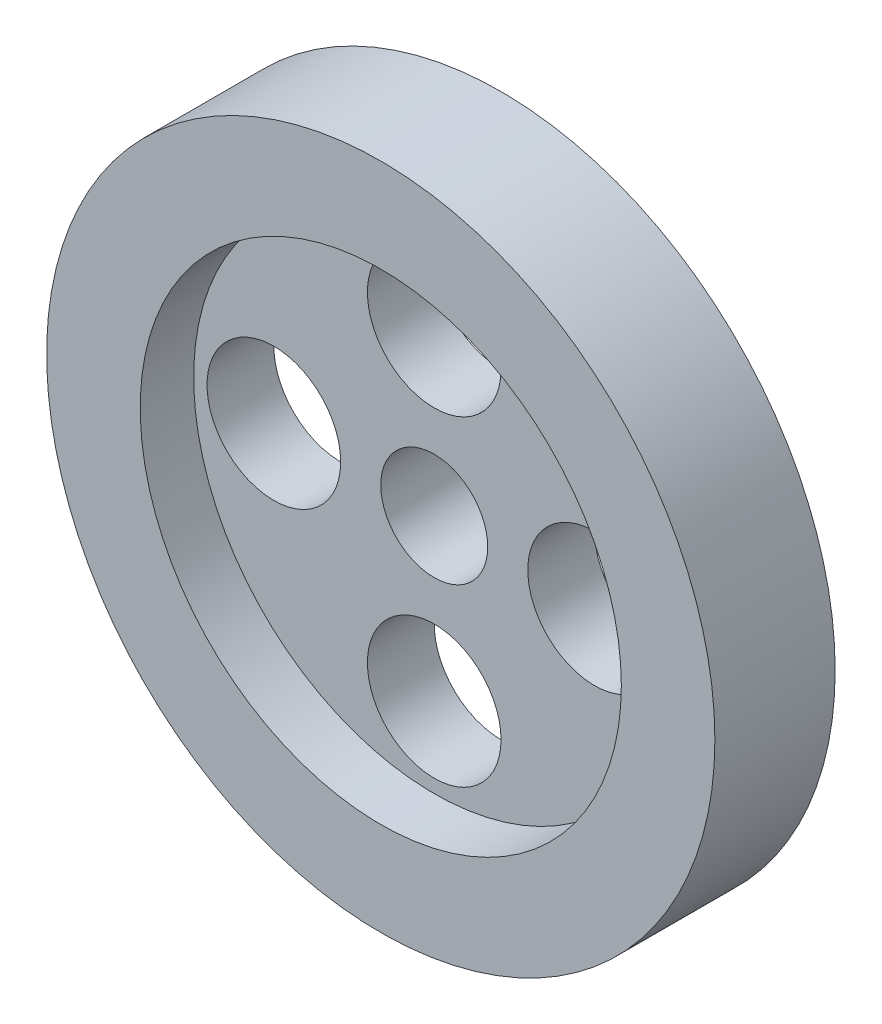
ISO-10303-21;
HEADER;
FILE_DESCRIPTION(('STEP AP214'),'2;1');
FILE_NAME('part.step','',(''),(''),'','','');
FILE_SCHEMA(('AUTOMOTIVE_DESIGN { 1 0 10303 214 1 1 1 1 }'));
ENDSEC;
DATA;
#1=APPLICATION_CONTEXT('core data for automotive mechanical design processes');
#2=APPLICATION_PROTOCOL_DEFINITION('international standard','automotive_design',2000,#1);
#3=PRODUCT_CONTEXT('',#1,'mechanical');
#4=PRODUCT('Part','Part','',(#3));
#5=PRODUCT_RELATED_PRODUCT_CATEGORY('part','',(#4));
#6=PRODUCT_DEFINITION_FORMATION('','',#4);
#7=PRODUCT_DEFINITION_CONTEXT('part definition',#1,'design');
#8=PRODUCT_DEFINITION('design','',#6,#7);
#9=PRODUCT_DEFINITION_SHAPE('','',#8);
#10=(LENGTH_UNIT() NAMED_UNIT(*) SI_UNIT(.MILLI.,.METRE.));
#11=(NAMED_UNIT(*) PLANE_ANGLE_UNIT() SI_UNIT($,.RADIAN.));
#12=(NAMED_UNIT(*) SI_UNIT($,.STERADIAN.) SOLID_ANGLE_UNIT());
#13=UNCERTAINTY_MEASURE_WITH_UNIT(LENGTH_MEASURE(1.E-05),#10,'distance_accuracy_value','');
#14=(GEOMETRIC_REPRESENTATION_CONTEXT(3) GLOBAL_UNCERTAINTY_ASSIGNED_CONTEXT((#13)) GLOBAL_UNIT_ASSIGNED_CONTEXT((#10,
#11,#12)) REPRESENTATION_CONTEXT('',''));
#15=CARTESIAN_POINT('',(0.,0.,0.));
#16=DIRECTION('',(0.,0.,1.));
#17=DIRECTION('',(1.,0.,0.));
#18=AXIS2_PLACEMENT_3D('',#15,#16,#17);
#19=CARTESIAN_POINT('',(0.,0.,0.));
#20=DIRECTION('',(0.,0.,1.));
#21=DIRECTION('',(1.,0.,0.));
#22=AXIS2_PLACEMENT_3D('',#19,#20,#21);
#23=PLANE('',#22);
#24=CARTESIAN_POINT('',(-12.,0.,0.));
#25=DIRECTION('',(0.,0.,1.));
#26=DIRECTION('',(1.,0.,0.));
#27=AXIS2_PLACEMENT_3D('',#24,#25,#26);
#28=CIRCLE('',#27,5.00000000000012);
#29=CARTESIAN_POINT('',(-6.99999999999988,0.,0.));
#30=VERTEX_POINT('',#29);
#31=EDGE_CURVE('E97',#30,#30,#28,.T.);
#32=ORIENTED_EDGE('',*,*,#31,.T.);
#33=EDGE_LOOP('',(#32));
#34=FACE_BOUND('',#33,.T.);
#35=CARTESIAN_POINT('',(0.,-12.,0.));
#36=DIRECTION('',(0.,0.,1.));
#37=DIRECTION('',(1.,0.,0.));
#38=AXIS2_PLACEMENT_3D('',#35,#36,#37);
#39=CIRCLE('',#38,5.00000000000008);
#40=CARTESIAN_POINT('',(5.00000000000008,-12.,0.));
#41=VERTEX_POINT('',#40);
#42=EDGE_CURVE('E101',#41,#41,#39,.T.);
#43=ORIENTED_EDGE('',*,*,#42,.T.);
#44=EDGE_LOOP('',(#43));
#45=FACE_BOUND('',#44,.T.);
#46=CARTESIAN_POINT('',(12.,0.,0.));
#47=DIRECTION('',(0.,0.,1.));
#48=DIRECTION('',(1.,0.,0.));
#49=AXIS2_PLACEMENT_3D('',#46,#47,#48);
#50=CIRCLE('',#49,5.);
#51=CARTESIAN_POINT('',(17.,0.,0.));
#52=VERTEX_POINT('',#51);
#53=EDGE_CURVE('E104',#52,#52,#50,.T.);
#54=ORIENTED_EDGE('',*,*,#53,.T.);
#55=EDGE_LOOP('',(#54));
#56=FACE_BOUND('',#55,.T.);
#57=CARTESIAN_POINT('',(0.,12.,0.));
#58=DIRECTION('',(0.,0.,1.));
#59=DIRECTION('',(1.,0.,0.));
#60=AXIS2_PLACEMENT_3D('',#57,#58,#59);
#61=CIRCLE('',#60,5.);
#62=CARTESIAN_POINT('',(5.,12.,0.));
#63=VERTEX_POINT('',#62);
#64=EDGE_CURVE('E58',#63,#63,#61,.T.);
#65=ORIENTED_EDGE('',*,*,#64,.T.);
#66=EDGE_LOOP('',(#65));
#67=FACE_BOUND('',#66,.T.);
#68=CARTESIAN_POINT('',(0.,0.,0.));
#69=DIRECTION('',(0.,0.,1.));
#70=DIRECTION('',(1.,0.,0.));
#71=AXIS2_PLACEMENT_3D('',#68,#69,#70);
#72=CIRCLE('',#71,25.);
#73=CARTESIAN_POINT('',(25.,0.,0.));
#74=VERTEX_POINT('',#73);
#75=EDGE_CURVE('E52',#74,#74,#72,.T.);
#76=ORIENTED_EDGE('',*,*,#75,.F.);
#77=EDGE_LOOP('',(#76));
#78=FACE_BOUND('',#77,.T.);
#79=CARTESIAN_POINT('',(0.,0.,0.));
#80=DIRECTION('',(0.,0.,1.));
#81=DIRECTION('',(1.,0.,0.));
#82=AXIS2_PLACEMENT_3D('',#79,#80,#81);
#83=CIRCLE('',#82,6.);
#84=CARTESIAN_POINT('',(6.,0.,0.));
#85=VERTEX_POINT('',#84);
#86=EDGE_CURVE('E10',#85,#85,#83,.F.);
#87=ORIENTED_EDGE('',*,*,#86,.F.);
#88=EDGE_LOOP('',(#87));
#89=FACE_BOUND('',#88,.T.);
#90=ADVANCED_FACE('F39',(#34,#45,#56,#67,#78,#89),#23,.F.);
#91=CARTESIAN_POINT('',(0.,12.,9.));
#92=DIRECTION('',(0.,0.,-1.));
#93=DIRECTION('',(-1.,0.,0.));
#94=AXIS2_PLACEMENT_3D('',#91,#92,#93);
#95=CYLINDRICAL_SURFACE('',#94,5.);
#96=ORIENTED_EDGE('',*,*,#64,.F.);
#97=EDGE_LOOP('',(#96));
#98=FACE_BOUND('',#97,.T.);
#99=CARTESIAN_POINT('',(0.,12.,5.));
#100=DIRECTION('',(0.,0.,1.));
#101=DIRECTION('',(1.,0.,0.));
#102=AXIS2_PLACEMENT_3D('',#99,#100,#101);
#103=CIRCLE('',#102,5.);
#104=CARTESIAN_POINT('',(5.,12.,5.));
#105=VERTEX_POINT('',#104);
#106=EDGE_CURVE('E93',#105,#105,#103,.T.);
#107=ORIENTED_EDGE('',*,*,#106,.T.);
#108=EDGE_LOOP('',(#107));
#109=FACE_BOUND('',#108,.T.);
#110=ADVANCED_FACE('F115',(#98,#109),#95,.F.);
#111=CARTESIAN_POINT('',(0.,0.,9.));
#112=DIRECTION('',(0.,0.,-1.));
#113=DIRECTION('',(-1.,0.,0.));
#114=AXIS2_PLACEMENT_3D('',#111,#112,#113);
#115=CYLINDRICAL_SURFACE('',#114,4.);
#116=CARTESIAN_POINT('',(0.,0.,5.));
#117=DIRECTION('',(0.,0.,1.));
#118=DIRECTION('',(1.,0.,0.));
#119=AXIS2_PLACEMENT_3D('',#116,#117,#118);
#120=CIRCLE('',#119,4.);
#121=CARTESIAN_POINT('',(4.,0.,5.));
#122=VERTEX_POINT('',#121);
#123=EDGE_CURVE('E89',#122,#122,#120,.T.);
#124=ORIENTED_EDGE('',*,*,#123,.T.);
#125=EDGE_LOOP('',(#124));
#126=FACE_BOUND('',#125,.T.);
#127=CARTESIAN_POINT('',(0.,0.,-1.));
#128=DIRECTION('',(0.,0.,-1.));
#129=DIRECTION('',(-1.,0.,0.));
#130=AXIS2_PLACEMENT_3D('',#127,#128,#129);
#131=CIRCLE('',#130,4.);
#132=CARTESIAN_POINT('',(-4.,0.,-1.));
#133=VERTEX_POINT('',#132);
#134=EDGE_CURVE('E167',#133,#133,#131,.T.);
#135=ORIENTED_EDGE('',*,*,#134,.T.);
#136=EDGE_LOOP('',(#135));
#137=FACE_BOUND('',#136,.T.);
#138=ADVANCED_FACE('F118',(#126,#137),#115,.F.);
#139=CARTESIAN_POINT('',(12.,0.,9.));
#140=DIRECTION('',(0.,0.,-1.));
#141=DIRECTION('',(-1.,0.,0.));
#142=AXIS2_PLACEMENT_3D('',#139,#140,#141);
#143=CYLINDRICAL_SURFACE('',#142,5.);
#144=ORIENTED_EDGE('',*,*,#53,.F.);
#145=EDGE_LOOP('',(#144));
#146=FACE_BOUND('',#145,.T.);
#147=CARTESIAN_POINT('',(12.,0.,5.));
#148=DIRECTION('',(0.,0.,1.));
#149=DIRECTION('',(1.,0.,0.));
#150=AXIS2_PLACEMENT_3D('',#147,#148,#149);
#151=CIRCLE('',#150,5.);
#152=CARTESIAN_POINT('',(17.,0.,5.));
#153=VERTEX_POINT('',#152);
#154=EDGE_CURVE('E72',#153,#153,#151,.T.);
#155=ORIENTED_EDGE('',*,*,#154,.T.);
#156=EDGE_LOOP('',(#155));
#157=FACE_BOUND('',#156,.T.);
#158=ADVANCED_FACE('F138',(#146,#157),#143,.F.);
#159=CARTESIAN_POINT('',(0.,-12.,9.));
#160=DIRECTION('',(0.,0.,-1.));
#161=DIRECTION('',(-1.,0.,0.));
#162=AXIS2_PLACEMENT_3D('',#159,#160,#161);
#163=CYLINDRICAL_SURFACE('',#162,5.00000000000008);
#164=ORIENTED_EDGE('',*,*,#42,.F.);
#165=EDGE_LOOP('',(#164));
#166=FACE_BOUND('',#165,.T.);
#167=CARTESIAN_POINT('',(0.,-12.,5.));
#168=DIRECTION('',(0.,0.,1.));
#169=DIRECTION('',(1.,0.,0.));
#170=AXIS2_PLACEMENT_3D('',#167,#168,#169);
#171=CIRCLE('',#170,5.00000000000008);
#172=CARTESIAN_POINT('',(5.00000000000008,-12.,5.));
#173=VERTEX_POINT('',#172);
#174=EDGE_CURVE('E65',#173,#173,#171,.T.);
#175=ORIENTED_EDGE('',*,*,#174,.T.);
#176=EDGE_LOOP('',(#175));
#177=FACE_BOUND('',#176,.T.);
#178=ADVANCED_FACE('F135',(#166,#177),#163,.F.);
#179=CARTESIAN_POINT('',(-12.,0.,9.));
#180=DIRECTION('',(0.,0.,-1.));
#181=DIRECTION('',(-1.,0.,0.));
#182=AXIS2_PLACEMENT_3D('',#179,#180,#181);
#183=CYLINDRICAL_SURFACE('',#182,5.00000000000012);
#184=ORIENTED_EDGE('',*,*,#31,.F.);
#185=EDGE_LOOP('',(#184));
#186=FACE_BOUND('',#185,.T.);
#187=CARTESIAN_POINT('',(-12.,0.,5.));
#188=DIRECTION('',(0.,0.,1.));
#189=DIRECTION('',(1.,0.,0.));
#190=AXIS2_PLACEMENT_3D('',#187,#188,#189);
#191=CIRCLE('',#190,5.00000000000012);
#192=CARTESIAN_POINT('',(-6.99999999999988,0.,5.));
#193=VERTEX_POINT('',#192);
#194=EDGE_CURVE('E62',#193,#193,#191,.T.);
#195=ORIENTED_EDGE('',*,*,#194,.T.);
#196=EDGE_LOOP('',(#195));
#197=FACE_BOUND('',#196,.T.);
#198=ADVANCED_FACE('F137',(#186,#197),#183,.F.);
#199=CARTESIAN_POINT('',(0.,0.,9.));
#200=DIRECTION('',(0.,0.,1.));
#201=DIRECTION('',(1.,0.,0.));
#202=AXIS2_PLACEMENT_3D('',#199,#200,#201);
#203=PLANE('',#202);
#204=CARTESIAN_POINT('',(0.,0.,9.));
#205=DIRECTION('',(0.,0.,1.));
#206=DIRECTION('',(1.,0.,0.));
#207=AXIS2_PLACEMENT_3D('',#204,#205,#206);
#208=CIRCLE('',#207,18.);
#209=CARTESIAN_POINT('',(18.,0.,9.));
#210=VERTEX_POINT('',#209);
#211=EDGE_CURVE('E75',#210,#210,#208,.T.);
#212=ORIENTED_EDGE('',*,*,#211,.F.);
#213=EDGE_LOOP('',(#212));
#214=FACE_BOUND('',#213,.T.);
#215=CARTESIAN_POINT('',(0.,0.,9.));
#216=DIRECTION('',(0.,0.,1.));
#217=DIRECTION('',(1.,0.,0.));
#218=AXIS2_PLACEMENT_3D('',#215,#216,#217);
#219=CIRCLE('',#218,25.);
#220=CARTESIAN_POINT('',(25.,0.,9.));
#221=VERTEX_POINT('',#220);
#222=EDGE_CURVE('E47',#221,#221,#219,.T.);
#223=ORIENTED_EDGE('',*,*,#222,.T.);
#224=EDGE_LOOP('',(#223));
#225=FACE_BOUND('',#224,.T.);
#226=ADVANCED_FACE('F145',(#214,#225),#203,.T.);
#227=CARTESIAN_POINT('',(0.,0.,9.));
#228=DIRECTION('',(0.,0.,-1.));
#229=DIRECTION('',(-1.,0.,0.));
#230=AXIS2_PLACEMENT_3D('',#227,#228,#229);
#231=CYLINDRICAL_SURFACE('',#230,25.);
#232=ORIENTED_EDGE('',*,*,#222,.F.);
#233=EDGE_LOOP('',(#232));
#234=FACE_BOUND('',#233,.T.);
#235=ORIENTED_EDGE('',*,*,#75,.T.);
#236=EDGE_LOOP('',(#235));
#237=FACE_BOUND('',#236,.T.);
#238=ADVANCED_FACE('F41',(#234,#237),#231,.T.);
#239=CARTESIAN_POINT('',(0.,0.,5.));
#240=DIRECTION('',(0.,0.,1.));
#241=DIRECTION('',(1.,0.,0.));
#242=AXIS2_PLACEMENT_3D('',#239,#240,#241);
#243=CYLINDRICAL_SURFACE('',#242,18.);
#244=CARTESIAN_POINT('',(0.,0.,5.));
#245=DIRECTION('',(0.,0.,1.));
#246=DIRECTION('',(1.,0.,0.));
#247=AXIS2_PLACEMENT_3D('',#244,#245,#246);
#248=CIRCLE('',#247,18.);
#249=CARTESIAN_POINT('',(18.,0.,5.));
#250=VERTEX_POINT('',#249);
#251=EDGE_CURVE('E66',#250,#250,#248,.T.);
#252=ORIENTED_EDGE('',*,*,#251,.F.);
#253=EDGE_LOOP('',(#252));
#254=FACE_BOUND('',#253,.T.);
#255=ORIENTED_EDGE('',*,*,#211,.T.);
#256=EDGE_LOOP('',(#255));
#257=FACE_BOUND('',#256,.T.);
#258=ADVANCED_FACE('F126',(#254,#257),#243,.F.);
#259=CARTESIAN_POINT('',(0.,0.,5.));
#260=DIRECTION('',(0.,0.,1.));
#261=DIRECTION('',(1.,0.,0.));
#262=AXIS2_PLACEMENT_3D('',#259,#260,#261);
#263=PLANE('',#262);
#264=ORIENTED_EDGE('',*,*,#106,.F.);
#265=EDGE_LOOP('',(#264));
#266=FACE_BOUND('',#265,.T.);
#267=ORIENTED_EDGE('',*,*,#123,.F.);
#268=EDGE_LOOP('',(#267));
#269=FACE_BOUND('',#268,.T.);
#270=ORIENTED_EDGE('',*,*,#154,.F.);
#271=EDGE_LOOP('',(#270));
#272=FACE_BOUND('',#271,.T.);
#273=ORIENTED_EDGE('',*,*,#174,.F.);
#274=EDGE_LOOP('',(#273));
#275=FACE_BOUND('',#274,.T.);
#276=ORIENTED_EDGE('',*,*,#194,.F.);
#277=EDGE_LOOP('',(#276));
#278=FACE_BOUND('',#277,.T.);
#279=ORIENTED_EDGE('',*,*,#251,.T.);
#280=EDGE_LOOP('',(#279));
#281=FACE_BOUND('',#280,.T.);
#282=ADVANCED_FACE('F122',(#266,#269,#272,#275,#278,#281),#263,.T.);
#283=CARTESIAN_POINT('',(0.,0.,-1.));
#284=DIRECTION('',(0.,0.,-1.));
#285=DIRECTION('',(-1.,0.,0.));
#286=AXIS2_PLACEMENT_3D('',#283,#284,#285);
#287=PLANE('',#286);
#288=CARTESIAN_POINT('',(0.,0.,-1.));
#289=DIRECTION('',(0.,0.,-1.));
#290=DIRECTION('',(-1.,0.,0.));
#291=AXIS2_PLACEMENT_3D('',#288,#289,#290);
#292=CIRCLE('',#291,6.);
#293=CARTESIAN_POINT('',(-6.,0.,-1.));
#294=VERTEX_POINT('',#293);
#295=EDGE_CURVE('E81',#294,#294,#292,.T.);
#296=ORIENTED_EDGE('',*,*,#295,.T.);
#297=EDGE_LOOP('',(#296));
#298=FACE_BOUND('',#297,.T.);
#299=ORIENTED_EDGE('',*,*,#134,.F.);
#300=EDGE_LOOP('',(#299));
#301=FACE_BOUND('',#300,.T.);
#302=ADVANCED_FACE('F125',(#298,#301),#287,.T.);
#303=CARTESIAN_POINT('',(0.,0.,-1.));
#304=DIRECTION('',(0.,0.,1.));
#305=DIRECTION('',(1.,0.,0.));
#306=AXIS2_PLACEMENT_3D('',#303,#304,#305);
#307=CYLINDRICAL_SURFACE('',#306,6.);
#308=ORIENTED_EDGE('',*,*,#295,.F.);
#309=EDGE_LOOP('',(#308));
#310=FACE_BOUND('',#309,.T.);
#311=ORIENTED_EDGE('',*,*,#86,.T.);
#312=EDGE_LOOP('',(#311));
#313=FACE_BOUND('',#312,.T.);
#314=ADVANCED_FACE('F175',(#310,#313),#307,.T.);
#315=CLOSED_SHELL('',(#90,#110,#138,#158,#178,#198,#226,#238,#258,#282,#302,#314));
#316=MANIFOLD_SOLID_BREP('B2',#315);
#317=ADVANCED_BREP_SHAPE_REPRESENTATION('',(#18,#316),#14);
#318=SHAPE_DEFINITION_REPRESENTATION(#9,#317);
ENDSEC;
END-ISO-10303-21;
